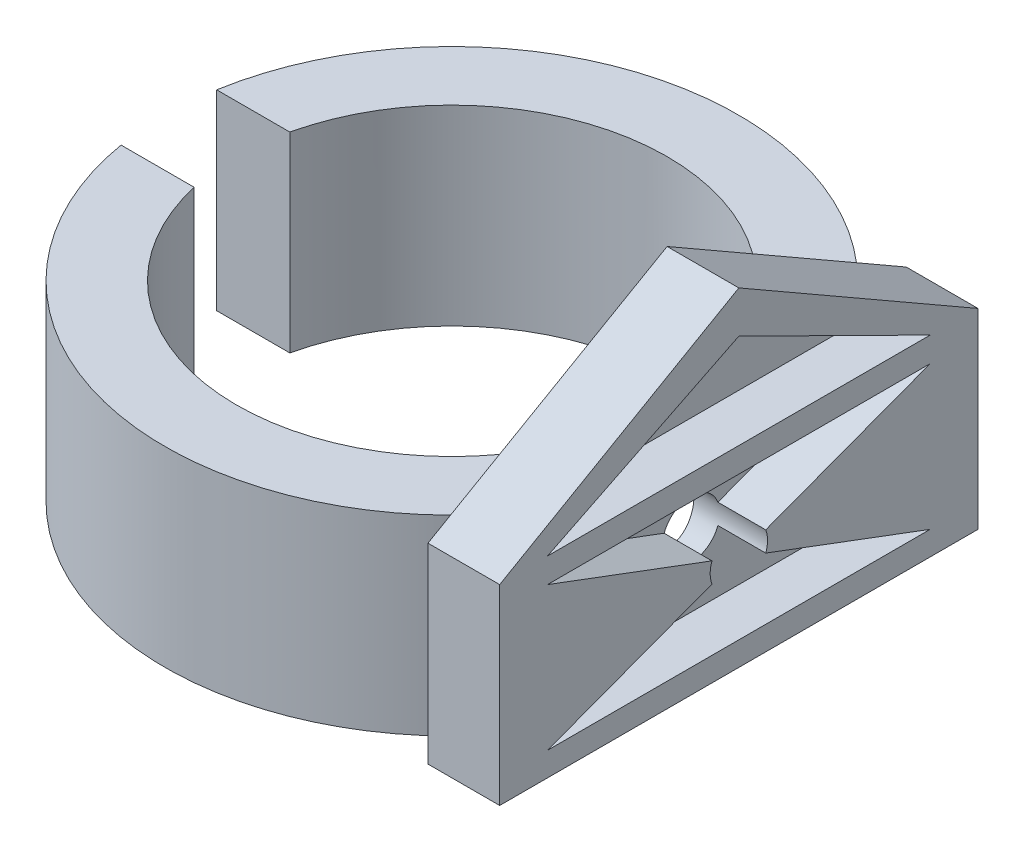
ISO-10303-21;
HEADER;
FILE_DESCRIPTION(('STEP AP214'),'2;1');
FILE_NAME('part.step','',(''),(''),'','','');
FILE_SCHEMA(('AUTOMOTIVE_DESIGN { 1 0 10303 214 1 1 1 1 }'));
ENDSEC;
DATA;
#1=APPLICATION_CONTEXT('core data for automotive mechanical design processes');
#2=APPLICATION_PROTOCOL_DEFINITION('international standard','automotive_design',2000,#1);
#3=PRODUCT_CONTEXT('',#1,'mechanical');
#4=PRODUCT('Part','Part','',(#3));
#5=PRODUCT_RELATED_PRODUCT_CATEGORY('part','',(#4));
#6=PRODUCT_DEFINITION_FORMATION('','',#4);
#7=PRODUCT_DEFINITION_CONTEXT('part definition',#1,'design');
#8=PRODUCT_DEFINITION('design','',#6,#7);
#9=PRODUCT_DEFINITION_SHAPE('','',#8);
#10=(LENGTH_UNIT() NAMED_UNIT(*) SI_UNIT(.MILLI.,.METRE.));
#11=(NAMED_UNIT(*) PLANE_ANGLE_UNIT() SI_UNIT($,.RADIAN.));
#12=(NAMED_UNIT(*) SI_UNIT($,.STERADIAN.) SOLID_ANGLE_UNIT());
#13=UNCERTAINTY_MEASURE_WITH_UNIT(LENGTH_MEASURE(1.E-05),#10,'distance_accuracy_value','');
#14=(GEOMETRIC_REPRESENTATION_CONTEXT(3) GLOBAL_UNCERTAINTY_ASSIGNED_CONTEXT((#13)) GLOBAL_UNIT_ASSIGNED_CONTEXT((#10,
#11,#12)) REPRESENTATION_CONTEXT('',''));
#15=CARTESIAN_POINT('',(0.,0.,0.));
#16=DIRECTION('',(0.,0.,1.));
#17=DIRECTION('',(1.,0.,0.));
#18=AXIS2_PLACEMENT_3D('',#15,#16,#17);
#19=CARTESIAN_POINT('',(0.,20.,0.));
#20=DIRECTION('',(0.,1.,0.));
#21=DIRECTION('',(0.,0.,1.));
#22=AXIS2_PLACEMENT_3D('',#19,#20,#21);
#23=PLANE('',#22);
#24=CARTESIAN_POINT('',(0.,20.,0.));
#25=DIRECTION('',(0.,1.,0.));
#26=DIRECTION('',(0.,0.,1.));
#27=AXIS2_PLACEMENT_3D('',#24,#25,#26);
#28=CIRCLE('',#27,30.);
#29=CARTESIAN_POINT('',(-29.5803989154981,20.,5.));
#30=VERTEX_POINT('',#29);
#31=CARTESIAN_POINT('',(22.5,20.,19.8431348329844));
#32=VERTEX_POINT('',#31);
#33=EDGE_CURVE('E357',#30,#32,#28,.T.);
#34=ORIENTED_EDGE('',*,*,#33,.T.);
#35=DIRECTION('',(0.,0.,-1.));
#36=VECTOR('',#35,1.);
#37=CARTESIAN_POINT('',(22.5,20.,25.));
#38=LINE('',#37,#36);
#39=CARTESIAN_POINT('',(22.5,20.,0.));
#40=VERTEX_POINT('',#39);
#41=EDGE_CURVE('E11',#32,#40,#38,.T.);
#42=ORIENTED_EDGE('',*,*,#41,.T.);
#43=CARTESIAN_POINT('',(0.,20.,0.));
#44=DIRECTION('',(0.,1.,0.));
#45=DIRECTION('',(0.,0.,1.));
#46=AXIS2_PLACEMENT_3D('',#43,#44,#45);
#47=CIRCLE('',#46,22.5);
#48=CARTESIAN_POINT('',(-21.9374109684803,20.,5.));
#49=VERTEX_POINT('',#48);
#50=EDGE_CURVE('E362',#49,#40,#47,.T.);
#51=ORIENTED_EDGE('',*,*,#50,.F.);
#52=DIRECTION('',(1.,0.,0.));
#53=VECTOR('',#52,1.);
#54=CARTESIAN_POINT('',(-33.9901992769391,20.,5.));
#55=LINE('',#54,#53);
#56=EDGE_CURVE('E392',#30,#49,#55,.T.);
#57=ORIENTED_EDGE('',*,*,#56,.F.);
#58=EDGE_LOOP('',(#34,#42,#51,#57));
#59=FACE_BOUND('',#58,.T.);
#60=ADVANCED_FACE('F33',(#59),#23,.T.);
#61=CARTESIAN_POINT('',(-21.9374109684803,20.,-5.));
#62=VERTEX_POINT('',#61);
#63=EDGE_CURVE('E376',#40,#62,#47,.T.);
#64=ORIENTED_EDGE('',*,*,#63,.F.);
#65=CARTESIAN_POINT('',(22.5,20.,-19.8431348329844));
#66=VERTEX_POINT('',#65);
#67=EDGE_CURVE('E42',#40,#66,#38,.T.);
#68=ORIENTED_EDGE('',*,*,#67,.T.);
#69=CARTESIAN_POINT('',(-29.5803989154981,20.,-5.));
#70=VERTEX_POINT('',#69);
#71=EDGE_CURVE('E360',#66,#70,#28,.T.);
#72=ORIENTED_EDGE('',*,*,#71,.T.);
#73=DIRECTION('',(-1.,0.,0.));
#74=VECTOR('',#73,1.);
#75=CARTESIAN_POINT('',(-33.9901992769391,20.,-5.));
#76=LINE('',#75,#74);
#77=EDGE_CURVE('E391',#62,#70,#76,.T.);
#78=ORIENTED_EDGE('',*,*,#77,.F.);
#79=EDGE_LOOP('',(#64,#68,#72,#78));
#80=FACE_BOUND('',#79,.T.);
#81=ADVANCED_FACE('F321',(#80),#23,.T.);
#82=CARTESIAN_POINT('',(25.,0.,0.));
#83=DIRECTION('',(1.,0.,0.));
#84=DIRECTION('',(0.,0.,-1.));
#85=AXIS2_PLACEMENT_3D('',#82,#83,#84);
#86=PLANE('',#85);
#87=CARTESIAN_POINT('',(25.,10.,-2.09488880330588E-13));
#88=DIRECTION('',(1.,0.,0.));
#89=DIRECTION('',(0.,0.,-1.));
#90=AXIS2_PLACEMENT_3D('',#87,#88,#89);
#91=CIRCLE('',#90,3.);
#92=CARTESIAN_POINT('',(25.,11.0533703247652,-2.80898753270732));
#93=VERTEX_POINT('',#92);
#94=CARTESIAN_POINT('',(25.,11.0533703247651,2.80898753270695));
#95=VERTEX_POINT('',#94);
#96=EDGE_CURVE('E369',#93,#95,#91,.T.);
#97=ORIENTED_EDGE('',*,*,#96,.F.);
#98=DIRECTION('',(0.,0.351123441588392,-0.936329177569044));
#99=VECTOR('',#98,1.);
#100=CARTESIAN_POINT('',(25.,17.5,-20.));
#101=LINE('',#100,#99);
#102=CARTESIAN_POINT('',(25.,17.5,-20.));
#103=VERTEX_POINT('',#102);
#104=EDGE_CURVE('E615',#93,#103,#101,.T.);
#105=ORIENTED_EDGE('',*,*,#104,.T.);
#106=DIRECTION('',(0.,0.,1.));
#107=VECTOR('',#106,1.);
#108=CARTESIAN_POINT('',(25.,17.5,-20.));
#109=LINE('',#108,#107);
#110=CARTESIAN_POINT('',(25.,17.5,20.));
#111=VERTEX_POINT('',#110);
#112=EDGE_CURVE('E622',#103,#111,#109,.T.);
#113=ORIENTED_EDGE('',*,*,#112,.T.);
#114=DIRECTION('',(0.,-0.351123441588391,-0.936329177569045));
#115=VECTOR('',#114,1.);
#116=CARTESIAN_POINT('',(25.,10.375,1.));
#117=LINE('',#116,#115);
#118=EDGE_CURVE('E252',#111,#95,#117,.T.);
#119=ORIENTED_EDGE('',*,*,#118,.T.);
#120=EDGE_LOOP('',(#97,#105,#113,#119));
#121=FACE_BOUND('',#120,.T.);
#122=ADVANCED_FACE('F272',(#121),#86,.T.);
#123=CARTESIAN_POINT('',(0.,20.,0.));
#124=DIRECTION('',(0.,-1.,0.));
#125=DIRECTION('',(0.,0.,-1.));
#126=AXIS2_PLACEMENT_3D('',#123,#124,#125);
#127=CYLINDRICAL_SURFACE('',#126,30.);
#128=DIRECTION('',(0.,-1.,0.));
#129=VECTOR('',#128,1.);
#130=CARTESIAN_POINT('',(-29.5803989154981,20.,-5.));
#131=LINE('',#130,#129);
#132=CARTESIAN_POINT('',(-29.5803989154981,0.,-5.));
#133=VERTEX_POINT('',#132);
#134=EDGE_CURVE('E354',#70,#133,#131,.T.);
#135=ORIENTED_EDGE('',*,*,#134,.F.);
#136=ORIENTED_EDGE('',*,*,#71,.F.);
#137=DIRECTION('',(0.,-1.,0.));
#138=VECTOR('',#137,1.);
#139=CARTESIAN_POINT('',(22.5,20.,-19.8431348329844));
#140=LINE('',#139,#138);
#141=CARTESIAN_POINT('',(22.5,0.,-19.8431348329844));
#142=VERTEX_POINT('',#141);
#143=EDGE_CURVE('E356',#142,#66,#140,.F.);
#144=ORIENTED_EDGE('',*,*,#143,.F.);
#145=CARTESIAN_POINT('',(0.,0.,0.));
#146=DIRECTION('',(0.,1.,0.));
#147=DIRECTION('',(0.,0.,1.));
#148=AXIS2_PLACEMENT_3D('',#145,#146,#147);
#149=CIRCLE('',#148,30.);
#150=EDGE_CURVE('E341',#142,#133,#149,.T.);
#151=ORIENTED_EDGE('',*,*,#150,.T.);
#152=EDGE_LOOP('',(#135,#136,#144,#151));
#153=FACE_BOUND('',#152,.T.);
#154=ADVANCED_FACE('F35',(#153),#127,.T.);
#155=DIRECTION('',(0.,-1.,0.));
#156=VECTOR('',#155,1.);
#157=CARTESIAN_POINT('',(-29.5803989154981,20.,5.));
#158=LINE('',#157,#156);
#159=CARTESIAN_POINT('',(-29.5803989154981,0.,5.));
#160=VERTEX_POINT('',#159);
#161=EDGE_CURVE('E394',#160,#30,#158,.F.);
#162=ORIENTED_EDGE('',*,*,#161,.F.);
#163=CARTESIAN_POINT('',(22.5,0.,19.8431348329844));
#164=VERTEX_POINT('',#163);
#165=EDGE_CURVE('E358',#160,#164,#149,.T.);
#166=ORIENTED_EDGE('',*,*,#165,.T.);
#167=DIRECTION('',(0.,-1.,0.));
#168=VECTOR('',#167,1.);
#169=CARTESIAN_POINT('',(22.5,20.,19.8431348329844));
#170=LINE('',#169,#168);
#171=EDGE_CURVE('E382',#32,#164,#170,.T.);
#172=ORIENTED_EDGE('',*,*,#171,.F.);
#173=ORIENTED_EDGE('',*,*,#33,.F.);
#174=EDGE_LOOP('',(#162,#166,#172,#173));
#175=FACE_BOUND('',#174,.T.);
#176=ADVANCED_FACE('F328',(#175),#127,.T.);
#177=CARTESIAN_POINT('',(0.,0.,0.));
#178=DIRECTION('',(0.,1.,0.));
#179=DIRECTION('',(0.,0.,1.));
#180=AXIS2_PLACEMENT_3D('',#177,#178,#179);
#181=PLANE('',#180);
#182=DIRECTION('',(-1.,0.,0.));
#183=VECTOR('',#182,1.);
#184=CARTESIAN_POINT('',(-33.9901992769391,0.,-5.));
#185=LINE('',#184,#183);
#186=CARTESIAN_POINT('',(-21.9374109684803,0.,-5.));
#187=VERTEX_POINT('',#186);
#188=EDGE_CURVE('E339',#187,#133,#185,.T.);
#189=ORIENTED_EDGE('',*,*,#188,.T.);
#190=ORIENTED_EDGE('',*,*,#150,.F.);
#191=DIRECTION('',(0.,0.,-1.));
#192=VECTOR('',#191,1.);
#193=CARTESIAN_POINT('',(22.5,0.,25.));
#194=LINE('',#193,#192);
#195=CARTESIAN_POINT('',(22.5,0.,-25.));
#196=VERTEX_POINT('',#195);
#197=EDGE_CURVE('E381',#142,#196,#194,.T.);
#198=ORIENTED_EDGE('',*,*,#197,.T.);
#199=DIRECTION('',(-1.,0.,0.));
#200=VECTOR('',#199,1.);
#201=CARTESIAN_POINT('',(30.,0.,-25.));
#202=LINE('',#201,#200);
#203=CARTESIAN_POINT('',(30.,0.,-25.));
#204=VERTEX_POINT('',#203);
#205=EDGE_CURVE('E411',#204,#196,#202,.T.);
#206=ORIENTED_EDGE('',*,*,#205,.F.);
#207=DIRECTION('',(0.,0.,-1.));
#208=VECTOR('',#207,1.);
#209=CARTESIAN_POINT('',(30.,0.,25.));
#210=LINE('',#209,#208);
#211=CARTESIAN_POINT('',(30.,0.,25.));
#212=VERTEX_POINT('',#211);
#213=EDGE_CURVE('E409',#212,#204,#210,.T.);
#214=ORIENTED_EDGE('',*,*,#213,.F.);
#215=DIRECTION('',(-1.,0.,0.));
#216=VECTOR('',#215,1.);
#217=CARTESIAN_POINT('',(30.,0.,25.));
#218=LINE('',#217,#216);
#219=CARTESIAN_POINT('',(22.5,0.,25.));
#220=VERTEX_POINT('',#219);
#221=EDGE_CURVE('E419',#212,#220,#218,.T.);
#222=ORIENTED_EDGE('',*,*,#221,.T.);
#223=EDGE_CURVE('E407',#220,#164,#194,.T.);
#224=ORIENTED_EDGE('',*,*,#223,.T.);
#225=ORIENTED_EDGE('',*,*,#165,.F.);
#226=DIRECTION('',(1.,0.,0.));
#227=VECTOR('',#226,1.);
#228=CARTESIAN_POINT('',(-33.9901992769391,0.,5.));
#229=LINE('',#228,#227);
#230=CARTESIAN_POINT('',(-21.9374109684803,0.,5.));
#231=VERTEX_POINT('',#230);
#232=EDGE_CURVE('E348',#160,#231,#229,.T.);
#233=ORIENTED_EDGE('',*,*,#232,.T.);
#234=CARTESIAN_POINT('',(0.,0.,0.));
#235=DIRECTION('',(0.,1.,0.));
#236=DIRECTION('',(0.,0.,1.));
#237=AXIS2_PLACEMENT_3D('',#234,#235,#236);
#238=CIRCLE('',#237,22.5);
#239=EDGE_CURVE('E345',#231,#187,#238,.T.);
#240=ORIENTED_EDGE('',*,*,#239,.T.);
#241=EDGE_LOOP('',(#189,#190,#198,#206,#214,#222,#224,#225,#233,#240));
#242=FACE_BOUND('',#241,.T.);
#243=ADVANCED_FACE('F326',(#242),#181,.F.);
#244=CARTESIAN_POINT('',(0.,20.,0.));
#245=DIRECTION('',(0.,-1.,0.));
#246=DIRECTION('',(0.,0.,-1.));
#247=AXIS2_PLACEMENT_3D('',#244,#245,#246);
#248=CYLINDRICAL_SURFACE('',#247,22.5);
#249=CARTESIAN_POINT('',(22.2991031209777,10.,-3.00000000000021));
#250=CARTESIAN_POINT('',(22.2991056676806,9.83229421679777,-2.99999292892204));
#251=CARTESIAN_POINT('',(22.3010154696116,9.66448595032542,-2.98588990056224));
#252=CARTESIAN_POINT('',(22.3084447289533,9.33354630649642,-2.92985694399204));
#253=CARTESIAN_POINT('',(22.3139678794925,9.17041989262426,-2.88789854473687));
#254=CARTESIAN_POINT('',(22.3279873821811,8.85368294766046,-2.7774196671042));
#255=CARTESIAN_POINT('',(22.3364816334313,8.70006578257344,-2.70891795412589));
#256=CARTESIAN_POINT('',(22.3554837337772,8.40653338643568,-2.5473384732105));
#257=CARTESIAN_POINT('',(22.3659912596801,8.26661596159296,-2.45426464895224));
#258=CARTESIAN_POINT('',(22.3879106598111,8.00353981799729,-2.24555055734298));
#259=CARTESIAN_POINT('',(22.399327327406,7.88048070148093,-2.1297852341231));
#260=CARTESIAN_POINT('',(22.4217356438735,7.65547563181543,-1.87924384308936));
#261=CARTESIAN_POINT('',(22.4327272708986,7.55353076278571,-1.74446679970818));
#262=CARTESIAN_POINT('',(22.4530964964055,7.37328723742539,-1.45909758739163));
#263=CARTESIAN_POINT('',(22.4624678475342,7.29507926606463,-1.30844765656704));
#264=CARTESIAN_POINT('',(22.4784878012371,7.1651107537288,-0.996005724056261));
#265=CARTESIAN_POINT('',(22.4851365182189,7.11334910143348,-0.834214190883811));
#266=CARTESIAN_POINT('',(22.4949282929341,7.0380416356296,-0.505103062521344));
#267=CARTESIAN_POINT('',(22.4980919730761,7.01432977748207,-0.337822085205056));
#268=CARTESIAN_POINT('',(22.5006277195728,6.99528008689477,-0.00162750345569448));
#269=CARTESIAN_POINT('',(22.4999999544425,6.99994099339522,0.16728602808349));
#270=CARTESIAN_POINT('',(22.4950401617536,7.03737209581142,0.500820186698445));
#271=CARTESIAN_POINT('',(22.4907316700671,7.06996369711847,0.665461256042468));
#272=CARTESIAN_POINT('',(22.4789208613843,7.16205149053226,0.986916184068623));
#273=CARTESIAN_POINT('',(22.4714184767105,7.22154825275217,1.14372987681255));
#274=CARTESIAN_POINT('',(22.4540222850625,7.36594516168273,1.44562771263598));
#275=CARTESIAN_POINT('',(22.4441212821882,7.45092193477462,1.59067477402968));
#276=CARTESIAN_POINT('',(22.4230342562856,7.64381088592428,1.86451753610197));
#277=CARTESIAN_POINT('',(22.4118481662644,7.7517242599417,1.99331238880002));
#278=CARTESIAN_POINT('',(22.3893388214349,7.98842177253839,2.23204509231787));
#279=CARTESIAN_POINT('',(22.378015176366,8.11736165229045,2.34182855029511));
#280=CARTESIAN_POINT('',(22.3565924815386,8.39191889705886,2.53822039585766));
#281=CARTESIAN_POINT('',(22.3464934366361,8.53753632820445,2.62482869154509));
#282=CARTESIAN_POINT('',(22.3286636450151,8.84146000052005,2.77242429129729));
#283=CARTESIAN_POINT('',(22.3209341432218,8.99977285677773,2.83339813360039));
#284=CARTESIAN_POINT('',(22.3087421319858,9.32451703095756,2.92785135067365));
#285=CARTESIAN_POINT('',(22.3042794425425,9.49094790103984,2.96133224031194));
#286=CARTESIAN_POINT('',(22.2991596751552,9.82583700250744,2.9996424115307));
#287=CARTESIAN_POINT('',(22.2984736726745,9.9942698954988,3.00468946648197));
#288=CARTESIAN_POINT('',(22.3009083644505,10.3295788841571,2.98656432283173));
#289=CARTESIAN_POINT('',(22.3040289660713,10.4964550176092,2.96339281094644));
#290=CARTESIAN_POINT('',(22.3136988065516,10.8232539796084,2.88967207555508));
#291=CARTESIAN_POINT('',(22.3202347168148,10.9832012395272,2.83922925485019));
#292=CARTESIAN_POINT('',(22.3359878852161,11.2923683701787,2.71250767620167));
#293=CARTESIAN_POINT('',(22.3452052497427,11.4415878149856,2.63622789314054));
#294=CARTESIAN_POINT('',(22.3653516992928,11.7260459656612,2.45946609625795));
#295=CARTESIAN_POINT('',(22.376290706837,11.8611955725524,2.3588418474943));
#296=CARTESIAN_POINT('',(22.3986171527477,12.1127664076556,2.13644748469177));
#297=CARTESIAN_POINT('',(22.410004610999,12.229186804222,2.0146764321561));
#298=CARTESIAN_POINT('',(22.43203422983,12.4407648308817,1.75249132253715));
#299=CARTESIAN_POINT('',(22.4426710507458,12.5357789745574,1.61196096139858));
#300=CARTESIAN_POINT('',(22.4619201221746,12.700852423263,1.31680867847622));
#301=CARTESIAN_POINT('',(22.4705324182274,12.7709122896342,1.16218707377034));
#302=CARTESIAN_POINT('',(22.4847384703673,12.8838538923822,0.843709158784941));
#303=CARTESIAN_POINT('',(22.4903412723117,12.9268171436253,0.679882176370834));
#304=CARTESIAN_POINT('',(22.4979347502993,12.9846107281915,0.347259740134587));
#305=CARTESIAN_POINT('',(22.499925612842,12.9994425140616,0.178464543299523));
#306=CARTESIAN_POINT('',(22.5000697087262,13.0005224008605,-0.157904810567589));
#307=CARTESIAN_POINT('',(22.4982525737009,12.9869912058916,-0.325478288883018));
#308=CARTESIAN_POINT('',(22.4910439982984,12.932198438152,-0.655946164578749));
#309=CARTESIAN_POINT('',(22.485652562927,12.890936904218,-0.818840568511819));
#310=CARTESIAN_POINT('',(22.4718983496352,12.7819269293851,-1.13528735188346));
#311=CARTESIAN_POINT('',(22.4635369261179,12.7141905603882,-1.28884395231592));
#312=CARTESIAN_POINT('',(22.4447662409466,12.5541766755311,-1.58244611794667));
#313=CARTESIAN_POINT('',(22.4343569414803,12.4618987065202,-1.72249143359952));
#314=CARTESIAN_POINT('',(22.4125543681221,12.2546099769957,-1.98622092909975));
#315=CARTESIAN_POINT('',(22.4011543544026,12.1394353147957,-2.10977573574409));
#316=CARTESIAN_POINT('',(22.3787079735476,11.8899653964245,-2.33588843381057));
#317=CARTESIAN_POINT('',(22.3676616905097,11.7556656341014,-2.43844136296158));
#318=CARTESIAN_POINT('',(22.3471216479154,11.4710740876578,-2.62003186467137));
#319=CARTESIAN_POINT('',(22.337634925064,11.3207146127921,-2.69896410641032));
#320=CARTESIAN_POINT('',(22.3213704974611,11.0088272987819,-2.83034277419589));
#321=CARTESIAN_POINT('',(22.3145898900774,10.8473116453756,-2.8828175949895));
#322=CARTESIAN_POINT('',(22.3061270075485,10.5708275819042,-2.94743220568259));
#323=CARTESIAN_POINT('',(22.3035064293224,10.4575925905458,-2.96711622203823));
#324=CARTESIAN_POINT('',(22.2999936221278,10.2295877357963,-2.99340248014695));
#325=CARTESIAN_POINT('',(22.2991013774062,10.1148178864045,-3.00000484113469));
#326=CARTESIAN_POINT('',(22.2991031209777,10.,-3.00000000000021));
#327=B_SPLINE_CURVE_WITH_KNOTS('',3,(#249,#250,#251,#252,#253,#254,#255,#256,#257,#258,#259,
#260,#261,#262,#263,#264,#265,#266,#267,#268,#269,#270,#271,#272,#273,#274,#275,#276,#277,#278,
#279,#280,#281,#282,#283,#284,#285,#286,#287,#288,#289,#290,#291,#292,#293,#294,#295,#296,#297,
#298,#299,#300,#301,#302,#303,#304,#305,#306,#307,#308,#309,#310,#311,#312,#313,#314,#315,#316,
#317,#318,#319,#320,#321,#322,#323,#324,#325,#326),.UNSPECIFIED.,.T.,.F.,(4,2,2,2,2,2,2,2,2,2,2,
2,2,2,2,2,2,2,2,2,2,2,2,2,2,2,2,2,2,2,2,2,2,2,2,2,2,2,4),(0.,0.502697833875671,1.00591026915852,
1.50876759415237,2.01154426252434,2.51717392681748,3.02282954643357,3.5303933478772,
4.03793581885392,4.54245854287453,5.04695884297285,5.54825713004929,6.04956604000018,
6.55239792684377,7.05525603876943,7.56202372603438,8.06879342278636,8.57582891483611,
9.08283646723652,9.58595553872895,10.0890623667531,10.5902202722789,11.0913980642731,
11.595577922135,12.0997801612593,12.6072676764676,13.1147437751273,13.620685856555,
14.1266018133322,14.6285956478445,15.1305887793096,15.6323532802529,16.1341270467162,
16.6396311355341,17.145254526141,17.6531001297407,18.1603995347189,18.5045691141841,
18.8487355566504),.UNSPECIFIED.);
#328=CARTESIAN_POINT('',(22.2991031209777,10.,-3.00000000000021));
#329=VERTEX_POINT('',#328);
#330=EDGE_CURVE('E244',#329,#329,#327,.T.);
#331=ORIENTED_EDGE('',*,*,#330,.F.);
#332=EDGE_LOOP('',(#331));
#333=FACE_BOUND('',#332,.T.);
#334=ORIENTED_EDGE('',*,*,#50,.T.);
#335=ORIENTED_EDGE('',*,*,#63,.T.);
#336=DIRECTION('',(0.,-1.,0.));
#337=VECTOR('',#336,1.);
#338=CARTESIAN_POINT('',(-21.9374109684803,20.,-5.));
#339=LINE('',#338,#337);
#340=EDGE_CURVE('E367',#62,#187,#339,.T.);
#341=ORIENTED_EDGE('',*,*,#340,.T.);
#342=ORIENTED_EDGE('',*,*,#239,.F.);
#343=DIRECTION('',(0.,-1.,0.));
#344=VECTOR('',#343,1.);
#345=CARTESIAN_POINT('',(-21.9374109684803,20.,5.));
#346=LINE('',#345,#344);
#347=EDGE_CURVE('E365',#231,#49,#346,.F.);
#348=ORIENTED_EDGE('',*,*,#347,.T.);
#349=EDGE_LOOP('',(#334,#335,#341,#342,#348));
#350=FACE_BOUND('',#349,.T.);
#351=ADVANCED_FACE('F254',(#333,#350),#248,.F.);
#352=CARTESIAN_POINT('',(30.,0.,0.));
#353=DIRECTION('',(1.,0.,0.));
#354=DIRECTION('',(0.,0.,-1.));
#355=AXIS2_PLACEMENT_3D('',#352,#353,#354);
#356=PLANE('',#355);
#357=DIRECTION('',(0.,-0.443717317072408,0.896166805081545));
#358=VECTOR('',#357,1.);
#359=CARTESIAN_POINT('',(30.,29.9909641759337,0.));
#360=LINE('',#359,#358);
#361=CARTESIAN_POINT('',(30.,29.9909641759337,0.));
#362=VERTEX_POINT('',#361);
#363=CARTESIAN_POINT('',(30.,20.0884033009629,20.));
#364=VERTEX_POINT('',#363);
#365=EDGE_CURVE('E50',#362,#364,#360,.T.);
#366=ORIENTED_EDGE('',*,*,#365,.F.);
#367=DIRECTION('',(0.,0.443717317072408,0.896166805081545));
#368=VECTOR('',#367,1.);
#369=CARTESIAN_POINT('',(30.,20.0884033009629,-20.));
#370=LINE('',#369,#368);
#371=CARTESIAN_POINT('',(30.,20.0884033009629,-20.));
#372=VERTEX_POINT('',#371);
#373=EDGE_CURVE('E203',#372,#362,#370,.T.);
#374=ORIENTED_EDGE('',*,*,#373,.F.);
#375=DIRECTION('',(0.,0.,-1.));
#376=VECTOR('',#375,1.);
#377=CARTESIAN_POINT('',(30.,20.0884033009629,20.));
#378=LINE('',#377,#376);
#379=EDGE_CURVE('E206',#364,#372,#378,.T.);
#380=ORIENTED_EDGE('',*,*,#379,.F.);
#381=EDGE_LOOP('',(#366,#374,#380));
#382=FACE_BOUND('',#381,.T.);
#383=CARTESIAN_POINT('',(30.,10.,-2.09488880330588E-13));
#384=DIRECTION('',(1.,0.,0.));
#385=DIRECTION('',(0.,0.,-1.));
#386=AXIS2_PLACEMENT_3D('',#383,#384,#385);
#387=CIRCLE('',#386,3.);
#388=CARTESIAN_POINT('',(30.,11.0533703247651,2.80898753270695));
#389=VERTEX_POINT('',#388);
#390=CARTESIAN_POINT('',(30.,8.94662967523489,2.80898753270695));
#391=VERTEX_POINT('',#390);
#392=EDGE_CURVE('E231',#389,#391,#387,.T.);
#393=ORIENTED_EDGE('',*,*,#392,.F.);
#394=DIRECTION('',(0.,-0.351123441588391,-0.936329177569045));
#395=VECTOR('',#394,1.);
#396=CARTESIAN_POINT('',(30.,10.375,1.));
#397=LINE('',#396,#395);
#398=CARTESIAN_POINT('',(30.,17.5,20.));
#399=VERTEX_POINT('',#398);
#400=EDGE_CURVE('E251',#399,#389,#397,.T.);
#401=ORIENTED_EDGE('',*,*,#400,.F.);
#402=DIRECTION('',(0.,0.,1.));
#403=VECTOR('',#402,1.);
#404=CARTESIAN_POINT('',(30.,17.5,-20.));
#405=LINE('',#404,#403);
#406=CARTESIAN_POINT('',(30.,17.5,-20.));
#407=VERTEX_POINT('',#406);
#408=EDGE_CURVE('E643',#407,#399,#405,.T.);
#409=ORIENTED_EDGE('',*,*,#408,.F.);
#410=DIRECTION('',(0.,0.351123441588392,-0.936329177569044));
#411=VECTOR('',#410,1.);
#412=CARTESIAN_POINT('',(30.,17.5,-20.));
#413=LINE('',#412,#411);
#414=CARTESIAN_POINT('',(30.,11.0533703247652,-2.80898753270732));
#415=VERTEX_POINT('',#414);
#416=EDGE_CURVE('E641',#415,#407,#413,.T.);
#417=ORIENTED_EDGE('',*,*,#416,.F.);
#418=CARTESIAN_POINT('',(30.,8.94662967523475,-2.80898753270732));
#419=VERTEX_POINT('',#418);
#420=EDGE_CURVE('E229',#419,#415,#387,.T.);
#421=ORIENTED_EDGE('',*,*,#420,.F.);
#422=DIRECTION('',(0.,0.351123441588391,0.936329177569045));
#423=VECTOR('',#422,1.);
#424=CARTESIAN_POINT('',(30.,2.5,-20.));
#425=LINE('',#424,#423);
#426=CARTESIAN_POINT('',(30.,2.5,-20.));
#427=VERTEX_POINT('',#426);
#428=EDGE_CURVE('E638',#427,#419,#425,.T.);
#429=ORIENTED_EDGE('',*,*,#428,.F.);
#430=DIRECTION('',(0.,0.,-1.));
#431=VECTOR('',#430,1.);
#432=CARTESIAN_POINT('',(30.,2.5,-20.));
#433=LINE('',#432,#431);
#434=CARTESIAN_POINT('',(30.,2.5,20.));
#435=VERTEX_POINT('',#434);
#436=EDGE_CURVE('E635',#435,#427,#433,.T.);
#437=ORIENTED_EDGE('',*,*,#436,.F.);
#438=DIRECTION('',(0.,-0.351123441588392,0.936329177569044));
#439=VECTOR('',#438,1.);
#440=CARTESIAN_POINT('',(30.,9.625,1.));
#441=LINE('',#440,#439);
#442=EDGE_CURVE('E633',#391,#435,#441,.T.);
#443=ORIENTED_EDGE('',*,*,#442,.F.);
#444=EDGE_LOOP('',(#393,#401,#409,#417,#421,#429,#437,#443));
#445=FACE_BOUND('',#444,.T.);
#446=ORIENTED_EDGE('',*,*,#213,.T.);
#447=DIRECTION('',(0.,1.,0.));
#448=VECTOR('',#447,1.);
#449=CARTESIAN_POINT('',(30.,20.,-25.));
#450=LINE('',#449,#448);
#451=CARTESIAN_POINT('',(30.,20.,-25.));
#452=VERTEX_POINT('',#451);
#453=EDGE_CURVE('E404',#204,#452,#450,.T.);
#454=ORIENTED_EDGE('',*,*,#453,.T.);
#455=DIRECTION('',(0.,0.498021777066641,0.867164522779492));
#456=VECTOR('',#455,1.);
#457=CARTESIAN_POINT('',(30.,20.,-25.));
#458=LINE('',#457,#456);
#459=CARTESIAN_POINT('',(30.,34.3577649910753,-2.09488880330588E-13));
#460=VERTEX_POINT('',#459);
#461=EDGE_CURVE('E214',#452,#460,#458,.T.);
#462=ORIENTED_EDGE('',*,*,#461,.T.);
#463=DIRECTION('',(0.,-0.498021777066635,0.867164522779496));
#464=VECTOR('',#463,1.);
#465=CARTESIAN_POINT('',(30.,20.,25.));
#466=LINE('',#465,#464);
#467=CARTESIAN_POINT('',(30.,20.,25.));
#468=VERTEX_POINT('',#467);
#469=EDGE_CURVE('E220',#460,#468,#466,.T.);
#470=ORIENTED_EDGE('',*,*,#469,.T.);
#471=DIRECTION('',(0.,-1.,0.));
#472=VECTOR('',#471,1.);
#473=CARTESIAN_POINT('',(30.,20.,25.));
#474=LINE('',#473,#472);
#475=EDGE_CURVE('E406',#468,#212,#474,.T.);
#476=ORIENTED_EDGE('',*,*,#475,.T.);
#477=EDGE_LOOP('',(#446,#454,#462,#470,#476));
#478=FACE_BOUND('',#477,.T.);
#479=ADVANCED_FACE('F305',(#382,#445,#478),#356,.T.);
#480=CARTESIAN_POINT('',(22.5,0.,0.));
#481=DIRECTION('',(1.,0.,0.));
#482=DIRECTION('',(0.,0.,-1.));
#483=AXIS2_PLACEMENT_3D('',#480,#481,#482);
#484=PLANE('',#483);
#485=DIRECTION('',(0.,-1.,0.));
#486=VECTOR('',#485,1.);
#487=CARTESIAN_POINT('',(22.5,20.,25.));
#488=LINE('',#487,#486);
#489=CARTESIAN_POINT('',(22.5,20.,25.));
#490=VERTEX_POINT('',#489);
#491=EDGE_CURVE('E413',#490,#220,#488,.T.);
#492=ORIENTED_EDGE('',*,*,#491,.F.);
#493=DIRECTION('',(0.,-0.498021777066635,0.867164522779496));
#494=VECTOR('',#493,1.);
#495=CARTESIAN_POINT('',(22.5,20.,25.));
#496=LINE('',#495,#494);
#497=CARTESIAN_POINT('',(22.5,34.3577649910753,-2.09488880330588E-13));
#498=VERTEX_POINT('',#497);
#499=EDGE_CURVE('E219',#498,#490,#496,.T.);
#500=ORIENTED_EDGE('',*,*,#499,.F.);
#501=DIRECTION('',(0.,0.498021777066641,0.867164522779492));
#502=VECTOR('',#501,1.);
#503=CARTESIAN_POINT('',(22.5,20.,-25.));
#504=LINE('',#503,#502);
#505=CARTESIAN_POINT('',(22.5,20.,-25.));
#506=VERTEX_POINT('',#505);
#507=EDGE_CURVE('E216',#506,#498,#504,.T.);
#508=ORIENTED_EDGE('',*,*,#507,.F.);
#509=DIRECTION('',(0.,1.,0.));
#510=VECTOR('',#509,1.);
#511=CARTESIAN_POINT('',(22.5,20.,-25.));
#512=LINE('',#511,#510);
#513=EDGE_CURVE('E403',#196,#506,#512,.T.);
#514=ORIENTED_EDGE('',*,*,#513,.F.);
#515=ORIENTED_EDGE('',*,*,#197,.F.);
#516=ORIENTED_EDGE('',*,*,#143,.T.);
#517=ORIENTED_EDGE('',*,*,#67,.F.);
#518=ORIENTED_EDGE('',*,*,#41,.F.);
#519=ORIENTED_EDGE('',*,*,#171,.T.);
#520=ORIENTED_EDGE('',*,*,#223,.F.);
#521=EDGE_LOOP('',(#492,#500,#508,#514,#515,#516,#517,#518,#519,#520));
#522=FACE_BOUND('',#521,.T.);
#523=ADVANCED_FACE('F308',(#522),#484,.F.);
#524=CARTESIAN_POINT('',(30.,20.,-25.));
#525=DIRECTION('',(0.,0.,1.));
#526=DIRECTION('',(1.,0.,0.));
#527=AXIS2_PLACEMENT_3D('',#524,#525,#526);
#528=PLANE('',#527);
#529=ORIENTED_EDGE('',*,*,#513,.T.);
#530=DIRECTION('',(-1.,0.,0.));
#531=VECTOR('',#530,1.);
#532=CARTESIAN_POINT('',(30.,20.,-25.));
#533=LINE('',#532,#531);
#534=EDGE_CURVE('E383',#452,#506,#533,.T.);
#535=ORIENTED_EDGE('',*,*,#534,.F.);
#536=ORIENTED_EDGE('',*,*,#453,.F.);
#537=ORIENTED_EDGE('',*,*,#205,.T.);
#538=EDGE_LOOP('',(#529,#535,#536,#537));
#539=FACE_BOUND('',#538,.T.);
#540=ADVANCED_FACE('F312',(#539),#528,.F.);
#541=CARTESIAN_POINT('',(30.,20.,25.));
#542=DIRECTION('',(0.,0.,-1.));
#543=DIRECTION('',(-1.,0.,0.));
#544=AXIS2_PLACEMENT_3D('',#541,#542,#543);
#545=PLANE('',#544);
#546=ORIENTED_EDGE('',*,*,#491,.T.);
#547=ORIENTED_EDGE('',*,*,#221,.F.);
#548=ORIENTED_EDGE('',*,*,#475,.F.);
#549=DIRECTION('',(-1.,0.,0.));
#550=VECTOR('',#549,1.);
#551=CARTESIAN_POINT('',(30.,20.,25.));
#552=LINE('',#551,#550);
#553=EDGE_CURVE('E387',#468,#490,#552,.T.);
#554=ORIENTED_EDGE('',*,*,#553,.T.);
#555=EDGE_LOOP('',(#546,#547,#548,#554));
#556=FACE_BOUND('',#555,.T.);
#557=ADVANCED_FACE('F300',(#556),#545,.F.);
#558=CARTESIAN_POINT('',(-33.9901992769391,20.,5.));
#559=DIRECTION('',(0.,0.,-1.));
#560=DIRECTION('',(-1.,0.,0.));
#561=AXIS2_PLACEMENT_3D('',#558,#559,#560);
#562=PLANE('',#561);
#563=ORIENTED_EDGE('',*,*,#161,.T.);
#564=ORIENTED_EDGE('',*,*,#56,.T.);
#565=ORIENTED_EDGE('',*,*,#347,.F.);
#566=ORIENTED_EDGE('',*,*,#232,.F.);
#567=EDGE_LOOP('',(#563,#564,#565,#566));
#568=FACE_BOUND('',#567,.T.);
#569=ADVANCED_FACE('F297',(#568),#562,.T.);
#570=CARTESIAN_POINT('',(-33.9901992769391,20.,-5.));
#571=DIRECTION('',(0.,0.,1.));
#572=DIRECTION('',(1.,0.,0.));
#573=AXIS2_PLACEMENT_3D('',#570,#571,#572);
#574=PLANE('',#573);
#575=ORIENTED_EDGE('',*,*,#134,.T.);
#576=ORIENTED_EDGE('',*,*,#188,.F.);
#577=ORIENTED_EDGE('',*,*,#340,.F.);
#578=ORIENTED_EDGE('',*,*,#77,.T.);
#579=EDGE_LOOP('',(#575,#576,#577,#578));
#580=FACE_BOUND('',#579,.T.);
#581=ADVANCED_FACE('F295',(#580),#574,.T.);
#582=CARTESIAN_POINT('',(25.,10.375,1.));
#583=DIRECTION('',(0.,-0.936329177569044,0.351123441588391));
#584=DIRECTION('',(0.,-0.351123441588391,-0.936329177569045));
#585=AXIS2_PLACEMENT_3D('',#582,#583,#584);
#586=PLANE('',#585);
#587=ORIENTED_EDGE('',*,*,#400,.T.);
#588=DIRECTION('',(1.,0.,0.));
#589=VECTOR('',#588,1.);
#590=CARTESIAN_POINT('',(20.,11.0533703247651,2.80898753270695));
#591=LINE('',#590,#589);
#592=EDGE_CURVE('E241',#389,#95,#591,.F.);
#593=ORIENTED_EDGE('',*,*,#592,.T.);
#594=ORIENTED_EDGE('',*,*,#118,.F.);
#595=DIRECTION('',(1.,0.,0.));
#596=VECTOR('',#595,1.);
#597=CARTESIAN_POINT('',(25.,17.5,20.));
#598=LINE('',#597,#596);
#599=EDGE_CURVE('E349',#111,#399,#598,.T.);
#600=ORIENTED_EDGE('',*,*,#599,.T.);
#601=EDGE_LOOP('',(#587,#593,#594,#600));
#602=FACE_BOUND('',#601,.T.);
#603=ADVANCED_FACE('F277',(#602),#586,.F.);
#604=CARTESIAN_POINT('',(25.,17.5,-20.));
#605=DIRECTION('',(0.,1.,0.));
#606=DIRECTION('',(0.,0.,1.));
#607=AXIS2_PLACEMENT_3D('',#604,#605,#606);
#608=PLANE('',#607);
#609=ORIENTED_EDGE('',*,*,#408,.T.);
#610=ORIENTED_EDGE('',*,*,#599,.F.);
#611=ORIENTED_EDGE('',*,*,#112,.F.);
#612=DIRECTION('',(1.,0.,0.));
#613=VECTOR('',#612,1.);
#614=CARTESIAN_POINT('',(25.,17.5,-20.));
#615=LINE('',#614,#613);
#616=EDGE_CURVE('E620',#103,#407,#615,.T.);
#617=ORIENTED_EDGE('',*,*,#616,.T.);
#618=EDGE_LOOP('',(#609,#610,#611,#617));
#619=FACE_BOUND('',#618,.T.);
#620=ADVANCED_FACE('F273',(#619),#608,.F.);
#621=CARTESIAN_POINT('',(25.,17.5,-20.));
#622=DIRECTION('',(0.,-0.936329177569045,-0.351123441588392));
#623=DIRECTION('',(0.,0.351123441588392,-0.936329177569045));
#624=AXIS2_PLACEMENT_3D('',#621,#622,#623);
#625=PLANE('',#624);
#626=ORIENTED_EDGE('',*,*,#104,.F.);
#627=DIRECTION('',(1.,0.,0.));
#628=VECTOR('',#627,1.);
#629=CARTESIAN_POINT('',(20.,11.0533703247652,-2.80898753270732));
#630=LINE('',#629,#628);
#631=EDGE_CURVE('E238',#93,#415,#630,.T.);
#632=ORIENTED_EDGE('',*,*,#631,.T.);
#633=ORIENTED_EDGE('',*,*,#416,.T.);
#634=ORIENTED_EDGE('',*,*,#616,.F.);
#635=EDGE_LOOP('',(#626,#632,#633,#634));
#636=FACE_BOUND('',#635,.T.);
#637=ADVANCED_FACE('F276',(#636),#625,.F.);
#638=CARTESIAN_POINT('',(25.,2.5,-20.));
#639=DIRECTION('',(0.,0.936329177569045,-0.351123441588391));
#640=DIRECTION('',(0.,0.351123441588391,0.936329177569045));
#641=AXIS2_PLACEMENT_3D('',#638,#639,#640);
#642=PLANE('',#641);
#643=ORIENTED_EDGE('',*,*,#428,.T.);
#644=DIRECTION('',(1.,0.,0.));
#645=VECTOR('',#644,1.);
#646=CARTESIAN_POINT('',(20.,8.94662967523476,-2.80898753270732));
#647=LINE('',#646,#645);
#648=CARTESIAN_POINT('',(25.,8.94662967523476,-2.80898753270732));
#649=VERTEX_POINT('',#648);
#650=EDGE_CURVE('E235',#419,#649,#647,.F.);
#651=ORIENTED_EDGE('',*,*,#650,.T.);
#652=DIRECTION('',(0.,0.351123441588391,0.936329177569045));
#653=VECTOR('',#652,1.);
#654=CARTESIAN_POINT('',(25.,2.5,-20.));
#655=LINE('',#654,#653);
#656=CARTESIAN_POINT('',(25.,2.5,-20.));
#657=VERTEX_POINT('',#656);
#658=EDGE_CURVE('E623',#657,#649,#655,.T.);
#659=ORIENTED_EDGE('',*,*,#658,.F.);
#660=DIRECTION('',(1.,0.,0.));
#661=VECTOR('',#660,1.);
#662=CARTESIAN_POINT('',(25.,2.5,-20.));
#663=LINE('',#662,#661);
#664=EDGE_CURVE('E647',#657,#427,#663,.T.);
#665=ORIENTED_EDGE('',*,*,#664,.T.);
#666=EDGE_LOOP('',(#643,#651,#659,#665));
#667=FACE_BOUND('',#666,.T.);
#668=ADVANCED_FACE('F281',(#667),#642,.F.);
#669=CARTESIAN_POINT('',(25.,2.5,-20.));
#670=DIRECTION('',(0.,-1.,0.));
#671=DIRECTION('',(0.,0.,-1.));
#672=AXIS2_PLACEMENT_3D('',#669,#670,#671);
#673=PLANE('',#672);
#674=ORIENTED_EDGE('',*,*,#436,.T.);
#675=ORIENTED_EDGE('',*,*,#664,.F.);
#676=DIRECTION('',(0.,0.,-1.));
#677=VECTOR('',#676,1.);
#678=CARTESIAN_POINT('',(25.,2.5,-20.));
#679=LINE('',#678,#677);
#680=CARTESIAN_POINT('',(25.,2.5,20.));
#681=VERTEX_POINT('',#680);
#682=EDGE_CURVE('E627',#681,#657,#679,.T.);
#683=ORIENTED_EDGE('',*,*,#682,.F.);
#684=DIRECTION('',(1.,0.,0.));
#685=VECTOR('',#684,1.);
#686=CARTESIAN_POINT('',(25.,2.5,20.));
#687=LINE('',#686,#685);
#688=EDGE_CURVE('E398',#681,#435,#687,.T.);
#689=ORIENTED_EDGE('',*,*,#688,.T.);
#690=EDGE_LOOP('',(#674,#675,#683,#689));
#691=FACE_BOUND('',#690,.T.);
#692=ADVANCED_FACE('F285',(#691),#673,.F.);
#693=CARTESIAN_POINT('',(25.,9.625,1.));
#694=DIRECTION('',(0.,0.936329177569044,0.351123441588392));
#695=DIRECTION('',(0.,-0.351123441588392,0.936329177569045));
#696=AXIS2_PLACEMENT_3D('',#693,#694,#695);
#697=PLANE('',#696);
#698=DIRECTION('',(0.,-0.351123441588392,0.936329177569044));
#699=VECTOR('',#698,1.);
#700=CARTESIAN_POINT('',(25.,9.625,1.));
#701=LINE('',#700,#699);
#702=CARTESIAN_POINT('',(25.,8.94662967523489,2.80898753270695));
#703=VERTEX_POINT('',#702);
#704=EDGE_CURVE('E660',#703,#681,#701,.T.);
#705=ORIENTED_EDGE('',*,*,#704,.F.);
#706=DIRECTION('',(1.,0.,0.));
#707=VECTOR('',#706,1.);
#708=CARTESIAN_POINT('',(20.,8.94662967523489,2.80898753270695));
#709=LINE('',#708,#707);
#710=EDGE_CURVE('E232',#703,#391,#709,.T.);
#711=ORIENTED_EDGE('',*,*,#710,.T.);
#712=ORIENTED_EDGE('',*,*,#442,.T.);
#713=ORIENTED_EDGE('',*,*,#688,.F.);
#714=EDGE_LOOP('',(#705,#711,#712,#713));
#715=FACE_BOUND('',#714,.T.);
#716=ADVANCED_FACE('F270',(#715),#697,.F.);
#717=EDGE_CURVE('E37',#703,#649,#91,.T.);
#718=ORIENTED_EDGE('',*,*,#717,.F.);
#719=ORIENTED_EDGE('',*,*,#704,.T.);
#720=ORIENTED_EDGE('',*,*,#682,.T.);
#721=ORIENTED_EDGE('',*,*,#658,.T.);
#722=EDGE_LOOP('',(#718,#719,#720,#721));
#723=FACE_BOUND('',#722,.T.);
#724=ADVANCED_FACE('F264',(#723),#86,.T.);
#725=CARTESIAN_POINT('',(20.,10.,-2.09488880330588E-13));
#726=DIRECTION('',(1.,0.,0.));
#727=DIRECTION('',(0.,0.,-1.));
#728=AXIS2_PLACEMENT_3D('',#725,#726,#727);
#729=CYLINDRICAL_SURFACE('',#728,3.);
#730=ORIENTED_EDGE('',*,*,#330,.T.);
#731=EDGE_LOOP('',(#730));
#732=FACE_BOUND('',#731,.T.);
#733=ORIENTED_EDGE('',*,*,#392,.T.);
#734=ORIENTED_EDGE('',*,*,#710,.F.);
#735=ORIENTED_EDGE('',*,*,#717,.T.);
#736=ORIENTED_EDGE('',*,*,#650,.F.);
#737=ORIENTED_EDGE('',*,*,#420,.T.);
#738=ORIENTED_EDGE('',*,*,#631,.F.);
#739=ORIENTED_EDGE('',*,*,#96,.T.);
#740=ORIENTED_EDGE('',*,*,#592,.F.);
#741=EDGE_LOOP('',(#733,#734,#735,#736,#737,#738,#739,#740));
#742=FACE_BOUND('',#741,.T.);
#743=ADVANCED_FACE('F258',(#732,#742),#729,.F.);
#744=CARTESIAN_POINT('',(22.5,20.,25.));
#745=DIRECTION('',(0.,0.867164522779496,0.498021777066635));
#746=DIRECTION('',(0.,-0.498021777066635,0.867164522779496));
#747=AXIS2_PLACEMENT_3D('',#744,#745,#746);
#748=PLANE('',#747);
#749=ORIENTED_EDGE('',*,*,#469,.F.);
#750=DIRECTION('',(1.,0.,0.));
#751=VECTOR('',#750,1.);
#752=CARTESIAN_POINT('',(22.5,34.3577649910753,-2.09488880330588E-13));
#753=LINE('',#752,#751);
#754=EDGE_CURVE('E223',#498,#460,#753,.T.);
#755=ORIENTED_EDGE('',*,*,#754,.F.);
#756=ORIENTED_EDGE('',*,*,#499,.T.);
#757=ORIENTED_EDGE('',*,*,#553,.F.);
#758=EDGE_LOOP('',(#749,#755,#756,#757));
#759=FACE_BOUND('',#758,.T.);
#760=ADVANCED_FACE('F263',(#759),#748,.T.);
#761=CARTESIAN_POINT('',(22.5,20.,-25.));
#762=DIRECTION('',(0.,0.867164522779492,-0.498021777066641));
#763=DIRECTION('',(0.,0.498021777066641,0.867164522779492));
#764=AXIS2_PLACEMENT_3D('',#761,#762,#763);
#765=PLANE('',#764);
#766=ORIENTED_EDGE('',*,*,#461,.F.);
#767=ORIENTED_EDGE('',*,*,#534,.T.);
#768=ORIENTED_EDGE('',*,*,#507,.T.);
#769=ORIENTED_EDGE('',*,*,#754,.T.);
#770=EDGE_LOOP('',(#766,#767,#768,#769));
#771=FACE_BOUND('',#770,.T.);
#772=ADVANCED_FACE('F266',(#771),#765,.T.);
#773=CARTESIAN_POINT('',(25.,29.9909641759337,0.));
#774=DIRECTION('',(0.,0.896166805081545,0.443717317072408));
#775=DIRECTION('',(0.,-0.443717317072408,0.896166805081545));
#776=AXIS2_PLACEMENT_3D('',#773,#774,#775);
#777=PLANE('',#776);
#778=ORIENTED_EDGE('',*,*,#365,.T.);
#779=DIRECTION('',(1.,0.,0.));
#780=VECTOR('',#779,1.);
#781=CARTESIAN_POINT('',(25.,20.0884033009629,20.));
#782=LINE('',#781,#780);
#783=CARTESIAN_POINT('',(25.,20.0884033009629,20.));
#784=VERTEX_POINT('',#783);
#785=EDGE_CURVE('E184',#784,#364,#782,.T.);
#786=ORIENTED_EDGE('',*,*,#785,.F.);
#787=DIRECTION('',(0.,-0.443717317072408,0.896166805081545));
#788=VECTOR('',#787,1.);
#789=CARTESIAN_POINT('',(25.,29.9909641759337,0.));
#790=LINE('',#789,#788);
#791=CARTESIAN_POINT('',(25.,29.9909641759337,0.));
#792=VERTEX_POINT('',#791);
#793=EDGE_CURVE('E188',#792,#784,#790,.T.);
#794=ORIENTED_EDGE('',*,*,#793,.F.);
#795=DIRECTION('',(1.,0.,0.));
#796=VECTOR('',#795,1.);
#797=CARTESIAN_POINT('',(25.,29.9909641759337,0.));
#798=LINE('',#797,#796);
#799=EDGE_CURVE('E212',#792,#362,#798,.T.);
#800=ORIENTED_EDGE('',*,*,#799,.T.);
#801=EDGE_LOOP('',(#778,#786,#794,#800));
#802=FACE_BOUND('',#801,.T.);
#803=ADVANCED_FACE('F186',(#802),#777,.F.);
#804=CARTESIAN_POINT('',(25.,20.0884033009629,-20.));
#805=DIRECTION('',(0.,0.896166805081545,-0.443717317072408));
#806=DIRECTION('',(0.,0.443717317072408,0.896166805081545));
#807=AXIS2_PLACEMENT_3D('',#804,#805,#806);
#808=PLANE('',#807);
#809=ORIENTED_EDGE('',*,*,#373,.T.);
#810=ORIENTED_EDGE('',*,*,#799,.F.);
#811=DIRECTION('',(0.,0.443717317072408,0.896166805081545));
#812=VECTOR('',#811,1.);
#813=CARTESIAN_POINT('',(25.,20.0884033009629,-20.));
#814=LINE('',#813,#812);
#815=CARTESIAN_POINT('',(25.,20.0884033009629,-20.));
#816=VERTEX_POINT('',#815);
#817=EDGE_CURVE('E194',#816,#792,#814,.T.);
#818=ORIENTED_EDGE('',*,*,#817,.F.);
#819=DIRECTION('',(1.,0.,0.));
#820=VECTOR('',#819,1.);
#821=CARTESIAN_POINT('',(25.,20.0884033009629,-20.));
#822=LINE('',#821,#820);
#823=EDGE_CURVE('E193',#816,#372,#822,.T.);
#824=ORIENTED_EDGE('',*,*,#823,.T.);
#825=EDGE_LOOP('',(#809,#810,#818,#824));
#826=FACE_BOUND('',#825,.T.);
#827=ADVANCED_FACE('F445',(#826),#808,.F.);
#828=CARTESIAN_POINT('',(25.,20.0884033009629,20.));
#829=DIRECTION('',(0.,-1.,0.));
#830=DIRECTION('',(0.,0.,-1.));
#831=AXIS2_PLACEMENT_3D('',#828,#829,#830);
#832=PLANE('',#831);
#833=ORIENTED_EDGE('',*,*,#379,.T.);
#834=ORIENTED_EDGE('',*,*,#823,.F.);
#835=DIRECTION('',(0.,0.,-1.));
#836=VECTOR('',#835,1.);
#837=CARTESIAN_POINT('',(25.,20.0884033009629,20.));
#838=LINE('',#837,#836);
#839=EDGE_CURVE('E197',#784,#816,#838,.T.);
#840=ORIENTED_EDGE('',*,*,#839,.F.);
#841=ORIENTED_EDGE('',*,*,#785,.T.);
#842=EDGE_LOOP('',(#833,#834,#840,#841));
#843=FACE_BOUND('',#842,.T.);
#844=ADVANCED_FACE('F198',(#843),#832,.F.);
#845=CARTESIAN_POINT('',(25.,0.,0.));
#846=DIRECTION('',(-1.,0.,0.));
#847=DIRECTION('',(0.,0.,1.));
#848=AXIS2_PLACEMENT_3D('',#845,#846,#847);
#849=PLANE('',#848);
#850=ORIENTED_EDGE('',*,*,#793,.T.);
#851=ORIENTED_EDGE('',*,*,#839,.T.);
#852=ORIENTED_EDGE('',*,*,#817,.T.);
#853=EDGE_LOOP('',(#850,#851,#852));
#854=FACE_BOUND('',#853,.T.);
#855=ADVANCED_FACE('F202',(#854),#849,.F.);
#856=CLOSED_SHELL('',(#60,#81,#122,#154,#176,#243,#351,#479,#523,#540,#557,#569,#581,#603,#620,
#637,#668,#692,#716,#724,#743,#760,#772,#803,#827,#844,#855));
#857=MANIFOLD_SOLID_BREP('B2',#856);
#858=ADVANCED_BREP_SHAPE_REPRESENTATION('',(#18,#857),#14);
#859=SHAPE_DEFINITION_REPRESENTATION(#9,#858);
ENDSEC;
END-ISO-10303-21;
